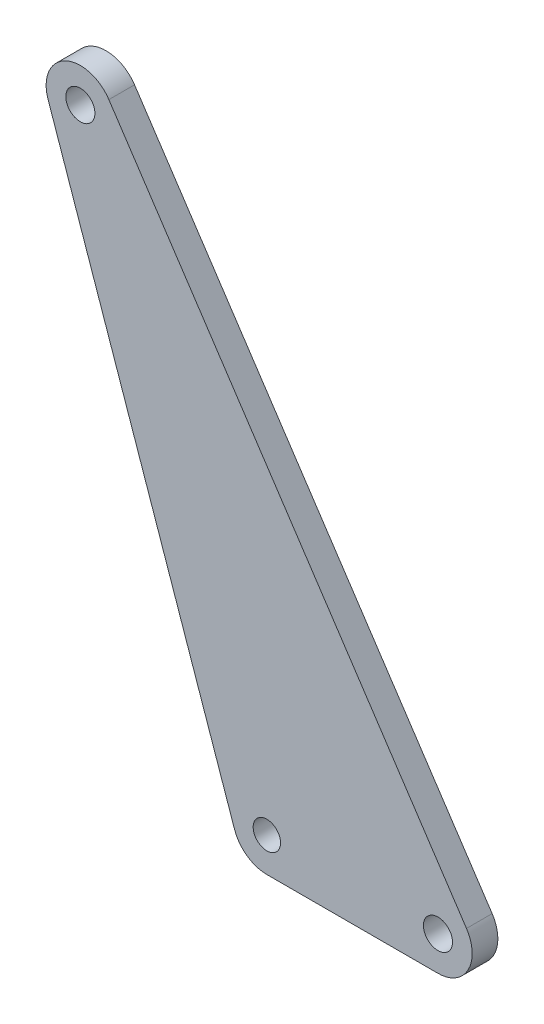
ISO-10303-21;
HEADER;
FILE_DESCRIPTION(('STEP AP214'),'2;1');
FILE_NAME('part.step','',(''),(''),'','','');
FILE_SCHEMA(('AUTOMOTIVE_DESIGN { 1 0 10303 214 1 1 1 1 }'));
ENDSEC;
DATA;
#1=APPLICATION_CONTEXT('core data for automotive mechanical design processes');
#2=APPLICATION_PROTOCOL_DEFINITION('international standard','automotive_design',2000,#1);
#3=PRODUCT_CONTEXT('',#1,'mechanical');
#4=PRODUCT('Part','Part','',(#3));
#5=PRODUCT_RELATED_PRODUCT_CATEGORY('part','',(#4));
#6=PRODUCT_DEFINITION_FORMATION('','',#4);
#7=PRODUCT_DEFINITION_CONTEXT('part definition',#1,'design');
#8=PRODUCT_DEFINITION('design','',#6,#7);
#9=PRODUCT_DEFINITION_SHAPE('','',#8);
#10=(LENGTH_UNIT() NAMED_UNIT(*) SI_UNIT(.MILLI.,.METRE.));
#11=(NAMED_UNIT(*) PLANE_ANGLE_UNIT() SI_UNIT($,.RADIAN.));
#12=(NAMED_UNIT(*) SI_UNIT($,.STERADIAN.) SOLID_ANGLE_UNIT());
#13=UNCERTAINTY_MEASURE_WITH_UNIT(LENGTH_MEASURE(1.E-05),#10,'distance_accuracy_value','');
#14=(GEOMETRIC_REPRESENTATION_CONTEXT(3) GLOBAL_UNCERTAINTY_ASSIGNED_CONTEXT((#13)) GLOBAL_UNIT_ASSIGNED_CONTEXT((#10,
#11,#12)) REPRESENTATION_CONTEXT('',''));
#15=CARTESIAN_POINT('',(0.,0.,0.));
#16=DIRECTION('',(0.,0.,1.));
#17=DIRECTION('',(1.,0.,0.));
#18=AXIS2_PLACEMENT_3D('',#15,#16,#17);
#19=CARTESIAN_POINT('',(-2.48309519991688,0.,3.));
#20=DIRECTION('',(0.,0.,-1.));
#21=DIRECTION('',(-1.,0.,0.));
#22=AXIS2_PLACEMENT_3D('',#19,#20,#21);
#23=CYLINDRICAL_SURFACE('',#22,4.);
#24=CARTESIAN_POINT('',(-2.48309519991688,0.,0.));
#25=DIRECTION('',(0.,0.,1.));
#26=DIRECTION('',(1.,0.,0.));
#27=AXIS2_PLACEMENT_3D('',#24,#25,#26);
#28=CIRCLE('',#27,4.);
#29=CARTESIAN_POINT('',(0.849981544624104,2.21146996701291,0.));
#30=VERTEX_POINT('',#29);
#31=CARTESIAN_POINT('',(-2.48309519991688,-4.,0.));
#32=VERTEX_POINT('',#31);
#33=EDGE_CURVE('E132',#30,#32,#28,.F.);
#34=ORIENTED_EDGE('',*,*,#33,.F.);
#35=DIRECTION('',(0.,0.,-1.));
#36=VECTOR('',#35,1.);
#37=CARTESIAN_POINT('',(0.849981544624104,2.21146996701291,3.));
#38=LINE('',#37,#36);
#39=CARTESIAN_POINT('',(0.849981544624104,2.21146996701291,3.));
#40=VERTEX_POINT('',#39);
#41=EDGE_CURVE('E11',#40,#30,#38,.T.);
#42=ORIENTED_EDGE('',*,*,#41,.F.);
#43=CARTESIAN_POINT('',(-2.48309519991688,0.,3.));
#44=DIRECTION('',(0.,0.,1.));
#45=DIRECTION('',(1.,0.,0.));
#46=AXIS2_PLACEMENT_3D('',#43,#44,#45);
#47=CIRCLE('',#46,4.);
#48=CARTESIAN_POINT('',(-2.48309519991688,-4.,3.));
#49=VERTEX_POINT('',#48);
#50=EDGE_CURVE('E153',#40,#49,#47,.F.);
#51=ORIENTED_EDGE('',*,*,#50,.T.);
#52=DIRECTION('',(0.,0.,-1.));
#53=VECTOR('',#52,1.);
#54=CARTESIAN_POINT('',(-2.48309519991688,-4.,3.));
#55=LINE('',#54,#53);
#56=EDGE_CURVE('E86',#49,#32,#55,.T.);
#57=ORIENTED_EDGE('',*,*,#56,.T.);
#58=EDGE_LOOP('',(#34,#42,#51,#57));
#59=FACE_BOUND('',#58,.T.);
#60=ADVANCED_FACE('F41',(#59),#23,.T.);
#61=CARTESIAN_POINT('',(1.60897054038054,1.06753918393502,3.));
#62=DIRECTION('',(0.833269186135246,0.552867491753226,0.));
#63=DIRECTION('',(-0.552867491753227,0.833269186135246,0.));
#64=AXIS2_PLACEMENT_3D('',#61,#62,#63);
#65=PLANE('',#64);
#66=DIRECTION('',(0.552867491753227,-0.833269186135246,0.));
#67=VECTOR('',#66,1.);
#68=CARTESIAN_POINT('',(1.60897054038054,1.06753918393502,0.));
#69=LINE('',#68,#67);
#70=CARTESIAN_POINT('',(-40.9500184553759,65.2114699670129,0.));
#71=VERTEX_POINT('',#70);
#72=EDGE_CURVE('E135',#71,#30,#69,.T.);
#73=ORIENTED_EDGE('',*,*,#72,.F.);
#74=DIRECTION('',(0.,0.,-1.));
#75=VECTOR('',#74,1.);
#76=CARTESIAN_POINT('',(-40.9500184553759,65.2114699670129,3.));
#77=LINE('',#76,#75);
#78=CARTESIAN_POINT('',(-40.9500184553759,65.2114699670129,3.));
#79=VERTEX_POINT('',#78);
#80=EDGE_CURVE('E49',#79,#71,#77,.T.);
#81=ORIENTED_EDGE('',*,*,#80,.F.);
#82=DIRECTION('',(0.552867491753227,-0.833269186135246,0.));
#83=VECTOR('',#82,1.);
#84=CARTESIAN_POINT('',(1.60897054038054,1.06753918393502,3.));
#85=LINE('',#84,#83);
#86=EDGE_CURVE('E166',#79,#40,#85,.T.);
#87=ORIENTED_EDGE('',*,*,#86,.T.);
#88=ORIENTED_EDGE('',*,*,#41,.T.);
#89=EDGE_LOOP('',(#73,#81,#87,#88));
#90=FACE_BOUND('',#89,.T.);
#91=ADVANCED_FACE('F165',(#90),#65,.T.);
#92=CARTESIAN_POINT('',(-44.2830951999169,63.,3.));
#93=DIRECTION('',(0.,0.,-1.));
#94=DIRECTION('',(-1.,0.,0.));
#95=AXIS2_PLACEMENT_3D('',#92,#93,#94);
#96=CYLINDRICAL_SURFACE('',#95,4.00000000000001);
#97=CARTESIAN_POINT('',(-44.2830951999169,63.,0.));
#98=DIRECTION('',(0.,0.,1.));
#99=DIRECTION('',(1.,0.,0.));
#100=AXIS2_PLACEMENT_3D('',#97,#98,#99);
#101=CIRCLE('',#100,4.00000000000001);
#102=CARTESIAN_POINT('',(-48.0631821429164,61.6919699149621,0.));
#103=VERTEX_POINT('',#102);
#104=EDGE_CURVE('E138',#71,#103,#101,.T.);
#105=ORIENTED_EDGE('',*,*,#104,.T.);
#106=DIRECTION('',(0.,0.,-1.));
#107=VECTOR('',#106,1.);
#108=CARTESIAN_POINT('',(-48.0631821429164,61.6919699149621,3.));
#109=LINE('',#108,#107);
#110=CARTESIAN_POINT('',(-48.0631821429164,61.6919699149621,3.));
#111=VERTEX_POINT('',#110);
#112=EDGE_CURVE('E115',#111,#103,#109,.T.);
#113=ORIENTED_EDGE('',*,*,#112,.F.);
#114=CARTESIAN_POINT('',(-44.2830951999169,63.,3.));
#115=DIRECTION('',(0.,0.,1.));
#116=DIRECTION('',(1.,0.,0.));
#117=AXIS2_PLACEMENT_3D('',#114,#115,#116);
#118=CIRCLE('',#117,4.00000000000001);
#119=EDGE_CURVE('E106',#79,#111,#118,.T.);
#120=ORIENTED_EDGE('',*,*,#119,.F.);
#121=ORIENTED_EDGE('',*,*,#80,.T.);
#122=EDGE_LOOP('',(#105,#113,#120,#121));
#123=FACE_BOUND('',#122,.T.);
#124=ADVANCED_FACE('F158',(#123),#96,.T.);
#125=CARTESIAN_POINT('',(-23.8589766628324,-8.25596335317058,3.));
#126=DIRECTION('',(0.945021735749886,0.327007521259485,0.));
#127=DIRECTION('',(-0.327007521259485,0.945021735749886,0.));
#128=AXIS2_PLACEMENT_3D('',#125,#126,#127);
#129=PLANE('',#128);
#130=DIRECTION('',(0.327007521259485,-0.945021735749886,0.));
#131=VECTOR('',#130,1.);
#132=CARTESIAN_POINT('',(-23.8589766628324,-8.25596335317058,0.));
#133=LINE('',#132,#131);
#134=CARTESIAN_POINT('',(-26.2631821429164,-1.30803008503794,0.));
#135=VERTEX_POINT('',#134);
#136=EDGE_CURVE('E114',#103,#135,#133,.T.);
#137=ORIENTED_EDGE('',*,*,#136,.T.);
#138=DIRECTION('',(0.,0.,-1.));
#139=VECTOR('',#138,1.);
#140=CARTESIAN_POINT('',(-26.2631821429164,-1.30803008503794,3.));
#141=LINE('',#140,#139);
#142=CARTESIAN_POINT('',(-26.2631821429164,-1.30803008503794,3.));
#143=VERTEX_POINT('',#142);
#144=EDGE_CURVE('E111',#143,#135,#141,.T.);
#145=ORIENTED_EDGE('',*,*,#144,.F.);
#146=DIRECTION('',(0.327007521259485,-0.945021735749886,0.));
#147=VECTOR('',#146,1.);
#148=CARTESIAN_POINT('',(-23.8589766628324,-8.25596335317058,3.));
#149=LINE('',#148,#147);
#150=EDGE_CURVE('E98',#111,#143,#149,.T.);
#151=ORIENTED_EDGE('',*,*,#150,.F.);
#152=ORIENTED_EDGE('',*,*,#112,.T.);
#153=EDGE_LOOP('',(#137,#145,#151,#152));
#154=FACE_BOUND('',#153,.T.);
#155=ADVANCED_FACE('F112',(#154),#129,.F.);
#156=CARTESIAN_POINT('',(-22.4830951999169,0.,3.));
#157=DIRECTION('',(0.,0.,-1.));
#158=DIRECTION('',(-1.,0.,0.));
#159=AXIS2_PLACEMENT_3D('',#156,#157,#158);
#160=CYLINDRICAL_SURFACE('',#159,4.);
#161=CARTESIAN_POINT('',(-22.4830951999169,0.,0.));
#162=DIRECTION('',(0.,0.,1.));
#163=DIRECTION('',(1.,0.,0.));
#164=AXIS2_PLACEMENT_3D('',#161,#162,#163);
#165=CIRCLE('',#164,4.);
#166=CARTESIAN_POINT('',(-22.4830951999169,-4.,0.));
#167=VERTEX_POINT('',#166);
#168=EDGE_CURVE('E79',#135,#167,#165,.T.);
#169=ORIENTED_EDGE('',*,*,#168,.T.);
#170=DIRECTION('',(0.,0.,-1.));
#171=VECTOR('',#170,1.);
#172=CARTESIAN_POINT('',(-22.4830951999169,-4.,3.));
#173=LINE('',#172,#171);
#174=CARTESIAN_POINT('',(-22.4830951999169,-4.,3.));
#175=VERTEX_POINT('',#174);
#176=EDGE_CURVE('E116',#175,#167,#173,.T.);
#177=ORIENTED_EDGE('',*,*,#176,.F.);
#178=CARTESIAN_POINT('',(-22.4830951999169,0.,3.));
#179=DIRECTION('',(0.,0.,1.));
#180=DIRECTION('',(1.,0.,0.));
#181=AXIS2_PLACEMENT_3D('',#178,#179,#180);
#182=CIRCLE('',#181,4.);
#183=EDGE_CURVE('E103',#143,#175,#182,.T.);
#184=ORIENTED_EDGE('',*,*,#183,.F.);
#185=ORIENTED_EDGE('',*,*,#144,.T.);
#186=EDGE_LOOP('',(#169,#177,#184,#185));
#187=FACE_BOUND('',#186,.T.);
#188=ADVANCED_FACE('F118',(#187),#160,.T.);
#189=CARTESIAN_POINT('',(-22.4830951999169,0.,3.));
#190=DIRECTION('',(0.,0.,-1.));
#191=DIRECTION('',(-1.,0.,0.));
#192=AXIS2_PLACEMENT_3D('',#189,#190,#191);
#193=CYLINDRICAL_SURFACE('',#192,1.6);
#194=CARTESIAN_POINT('',(-22.4830951999169,0.,3.));
#195=DIRECTION('',(0.,0.,1.));
#196=DIRECTION('',(1.,0.,0.));
#197=AXIS2_PLACEMENT_3D('',#194,#195,#196);
#198=CIRCLE('',#197,1.6);
#199=CARTESIAN_POINT('',(-20.8830951999169,0.,3.));
#200=VERTEX_POINT('',#199);
#201=EDGE_CURVE('E126',#200,#200,#198,.T.);
#202=ORIENTED_EDGE('',*,*,#201,.T.);
#203=EDGE_LOOP('',(#202));
#204=FACE_BOUND('',#203,.T.);
#205=CARTESIAN_POINT('',(-22.4830951999169,0.,0.));
#206=DIRECTION('',(0.,0.,1.));
#207=DIRECTION('',(1.,0.,0.));
#208=AXIS2_PLACEMENT_3D('',#205,#206,#207);
#209=CIRCLE('',#208,1.6);
#210=CARTESIAN_POINT('',(-20.8830951999169,0.,0.));
#211=VERTEX_POINT('',#210);
#212=EDGE_CURVE('E147',#211,#211,#209,.T.);
#213=ORIENTED_EDGE('',*,*,#212,.F.);
#214=EDGE_LOOP('',(#213));
#215=FACE_BOUND('',#214,.T.);
#216=ADVANCED_FACE('F182',(#204,#215),#193,.F.);
#217=CARTESIAN_POINT('',(-2.48309519991688,0.,3.));
#218=DIRECTION('',(0.,0.,-1.));
#219=DIRECTION('',(-1.,0.,0.));
#220=AXIS2_PLACEMENT_3D('',#217,#218,#219);
#221=CYLINDRICAL_SURFACE('',#220,1.7);
#222=CARTESIAN_POINT('',(-2.48309519991688,0.,3.));
#223=DIRECTION('',(0.,0.,1.));
#224=DIRECTION('',(1.,0.,0.));
#225=AXIS2_PLACEMENT_3D('',#222,#223,#224);
#226=CIRCLE('',#225,1.7);
#227=CARTESIAN_POINT('',(-0.783095199916879,0.,3.));
#228=VERTEX_POINT('',#227);
#229=EDGE_CURVE('E120',#228,#228,#226,.T.);
#230=ORIENTED_EDGE('',*,*,#229,.T.);
#231=EDGE_LOOP('',(#230));
#232=FACE_BOUND('',#231,.T.);
#233=CARTESIAN_POINT('',(-2.48309519991688,0.,0.));
#234=DIRECTION('',(0.,0.,1.));
#235=DIRECTION('',(1.,0.,0.));
#236=AXIS2_PLACEMENT_3D('',#233,#234,#235);
#237=CIRCLE('',#236,1.7);
#238=CARTESIAN_POINT('',(-0.783095199916879,0.,0.));
#239=VERTEX_POINT('',#238);
#240=EDGE_CURVE('E144',#239,#239,#237,.T.);
#241=ORIENTED_EDGE('',*,*,#240,.F.);
#242=EDGE_LOOP('',(#241));
#243=FACE_BOUND('',#242,.T.);
#244=ADVANCED_FACE('F174',(#232,#243),#221,.F.);
#245=CARTESIAN_POINT('',(0.,-4.,3.));
#246=DIRECTION('',(0.,1.,0.));
#247=DIRECTION('',(-1.,0.,0.));
#248=AXIS2_PLACEMENT_3D('',#245,#246,#247);
#249=PLANE('',#248);
#250=DIRECTION('',(1.,0.,0.));
#251=VECTOR('',#250,1.);
#252=CARTESIAN_POINT('',(0.,-4.,0.));
#253=LINE('',#252,#251);
#254=EDGE_CURVE('E142',#167,#32,#253,.T.);
#255=ORIENTED_EDGE('',*,*,#254,.T.);
#256=ORIENTED_EDGE('',*,*,#56,.F.);
#257=DIRECTION('',(1.,0.,0.));
#258=VECTOR('',#257,1.);
#259=CARTESIAN_POINT('',(0.,-4.,3.));
#260=LINE('',#259,#258);
#261=EDGE_CURVE('E57',#175,#49,#260,.T.);
#262=ORIENTED_EDGE('',*,*,#261,.F.);
#263=ORIENTED_EDGE('',*,*,#176,.T.);
#264=EDGE_LOOP('',(#255,#256,#262,#263));
#265=FACE_BOUND('',#264,.T.);
#266=ADVANCED_FACE('F169',(#265),#249,.F.);
#267=CARTESIAN_POINT('',(-44.2830951999169,63.,3.));
#268=DIRECTION('',(0.,0.,-1.));
#269=DIRECTION('',(-1.,0.,0.));
#270=AXIS2_PLACEMENT_3D('',#267,#268,#269);
#271=CYLINDRICAL_SURFACE('',#270,1.7);
#272=CARTESIAN_POINT('',(-44.2830951999169,63.,3.));
#273=DIRECTION('',(0.,0.,1.));
#274=DIRECTION('',(1.,0.,0.));
#275=AXIS2_PLACEMENT_3D('',#272,#273,#274);
#276=CIRCLE('',#275,1.7);
#277=CARTESIAN_POINT('',(-42.5830951999169,63.,3.));
#278=VERTEX_POINT('',#277);
#279=EDGE_CURVE('E129',#278,#278,#276,.T.);
#280=ORIENTED_EDGE('',*,*,#279,.T.);
#281=EDGE_LOOP('',(#280));
#282=FACE_BOUND('',#281,.T.);
#283=CARTESIAN_POINT('',(-44.2830951999169,63.,0.));
#284=DIRECTION('',(0.,0.,1.));
#285=DIRECTION('',(1.,0.,0.));
#286=AXIS2_PLACEMENT_3D('',#283,#284,#285);
#287=CIRCLE('',#286,1.7);
#288=CARTESIAN_POINT('',(-42.5830951999169,63.,0.));
#289=VERTEX_POINT('',#288);
#290=EDGE_CURVE('E150',#289,#289,#287,.T.);
#291=ORIENTED_EDGE('',*,*,#290,.F.);
#292=EDGE_LOOP('',(#291));
#293=FACE_BOUND('',#292,.T.);
#294=ADVANCED_FACE('F173',(#282,#293),#271,.F.);
#295=CARTESIAN_POINT('',(0.,0.,3.));
#296=DIRECTION('',(0.,0.,1.));
#297=DIRECTION('',(1.,0.,0.));
#298=AXIS2_PLACEMENT_3D('',#295,#296,#297);
#299=PLANE('',#298);
#300=ORIENTED_EDGE('',*,*,#50,.F.);
#301=ORIENTED_EDGE('',*,*,#86,.F.);
#302=ORIENTED_EDGE('',*,*,#119,.T.);
#303=ORIENTED_EDGE('',*,*,#150,.T.);
#304=ORIENTED_EDGE('',*,*,#183,.T.);
#305=ORIENTED_EDGE('',*,*,#261,.T.);
#306=EDGE_LOOP('',(#300,#301,#302,#303,#304,#305));
#307=FACE_BOUND('',#306,.T.);
#308=ORIENTED_EDGE('',*,*,#229,.F.);
#309=EDGE_LOOP('',(#308));
#310=FACE_BOUND('',#309,.T.);
#311=ORIENTED_EDGE('',*,*,#201,.F.);
#312=EDGE_LOOP('',(#311));
#313=FACE_BOUND('',#312,.T.);
#314=ORIENTED_EDGE('',*,*,#279,.F.);
#315=EDGE_LOOP('',(#314));
#316=FACE_BOUND('',#315,.T.);
#317=ADVANCED_FACE('F100',(#307,#310,#313,#316),#299,.T.);
#318=CARTESIAN_POINT('',(0.,0.,0.));
#319=DIRECTION('',(0.,0.,1.));
#320=DIRECTION('',(1.,0.,0.));
#321=AXIS2_PLACEMENT_3D('',#318,#319,#320);
#322=PLANE('',#321);
#323=ORIENTED_EDGE('',*,*,#33,.T.);
#324=ORIENTED_EDGE('',*,*,#254,.F.);
#325=ORIENTED_EDGE('',*,*,#168,.F.);
#326=ORIENTED_EDGE('',*,*,#136,.F.);
#327=ORIENTED_EDGE('',*,*,#104,.F.);
#328=ORIENTED_EDGE('',*,*,#72,.T.);
#329=EDGE_LOOP('',(#323,#324,#325,#326,#327,#328));
#330=FACE_BOUND('',#329,.T.);
#331=ORIENTED_EDGE('',*,*,#240,.T.);
#332=EDGE_LOOP('',(#331));
#333=FACE_BOUND('',#332,.T.);
#334=ORIENTED_EDGE('',*,*,#212,.T.);
#335=EDGE_LOOP('',(#334));
#336=FACE_BOUND('',#335,.T.);
#337=ORIENTED_EDGE('',*,*,#290,.T.);
#338=EDGE_LOOP('',(#337));
#339=FACE_BOUND('',#338,.T.);
#340=ADVANCED_FACE('F163',(#330,#333,#336,#339),#322,.F.);
#341=CLOSED_SHELL('',(#60,#91,#124,#155,#188,#216,#244,#266,#294,#317,#340));
#342=MANIFOLD_SOLID_BREP('B2',#341);
#343=ADVANCED_BREP_SHAPE_REPRESENTATION('',(#18,#342),#14);
#344=SHAPE_DEFINITION_REPRESENTATION(#9,#343);
ENDSEC;
END-ISO-10303-21;
